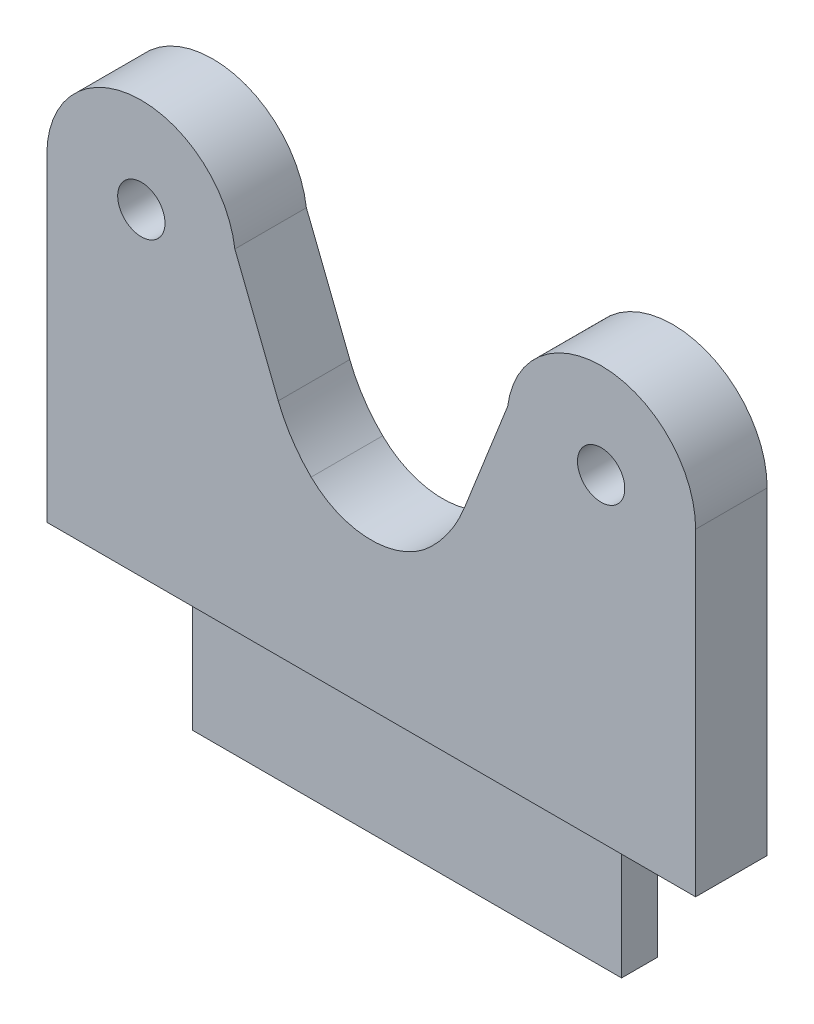
ISO-10303-21;
HEADER;
FILE_DESCRIPTION(('STEP AP214'),'2;1');
FILE_NAME('part.step','',(''),(''),'','','');
FILE_SCHEMA(('AUTOMOTIVE_DESIGN { 1 0 10303 214 1 1 1 1 }'));
ENDSEC;
DATA;
#1=APPLICATION_CONTEXT('core data for automotive mechanical design processes');
#2=APPLICATION_PROTOCOL_DEFINITION('international standard','automotive_design',2000,#1);
#3=PRODUCT_CONTEXT('',#1,'mechanical');
#4=PRODUCT('Part','Part','',(#3));
#5=PRODUCT_RELATED_PRODUCT_CATEGORY('part','',(#4));
#6=PRODUCT_DEFINITION_FORMATION('','',#4);
#7=PRODUCT_DEFINITION_CONTEXT('part definition',#1,'design');
#8=PRODUCT_DEFINITION('design','',#6,#7);
#9=PRODUCT_DEFINITION_SHAPE('','',#8);
#10=(LENGTH_UNIT() NAMED_UNIT(*) SI_UNIT(.MILLI.,.METRE.));
#11=(NAMED_UNIT(*) PLANE_ANGLE_UNIT() SI_UNIT($,.RADIAN.));
#12=(NAMED_UNIT(*) SI_UNIT($,.STERADIAN.) SOLID_ANGLE_UNIT());
#13=UNCERTAINTY_MEASURE_WITH_UNIT(LENGTH_MEASURE(1.E-05),#10,'distance_accuracy_value','');
#14=(GEOMETRIC_REPRESENTATION_CONTEXT(3) GLOBAL_UNCERTAINTY_ASSIGNED_CONTEXT((#13)) GLOBAL_UNIT_ASSIGNED_CONTEXT((#10,
#11,#12)) REPRESENTATION_CONTEXT('',''));
#15=CARTESIAN_POINT('',(0.,0.,0.));
#16=DIRECTION('',(0.,0.,1.));
#17=DIRECTION('',(1.,0.,0.));
#18=AXIS2_PLACEMENT_3D('',#15,#16,#17);
#19=CARTESIAN_POINT('',(0.,0.,0.));
#20=DIRECTION('',(0.,0.,1.));
#21=DIRECTION('',(1.,0.,0.));
#22=AXIS2_PLACEMENT_3D('',#19,#20,#21);
#23=PLANE('',#22);
#24=CARTESIAN_POINT('',(21.5908533619969,-2.54,0.));
#25=DIRECTION('',(0.,0.,1.));
#26=DIRECTION('',(1.,0.,0.));
#27=AXIS2_PLACEMENT_3D('',#24,#25,#26);
#28=CIRCLE('',#27,2.54);
#29=CARTESIAN_POINT('',(19.0510240343963,-2.5105553628006,0.));
#30=VERTEX_POINT('',#29);
#31=CARTESIAN_POINT('',(21.5908533619969,0.,0.));
#32=VERTEX_POINT('',#31);
#33=EDGE_CURVE('E48',#30,#32,#28,.F.);
#34=ORIENTED_EDGE('',*,*,#33,.T.);
#35=DIRECTION('',(-1.,0.,0.));
#36=VECTOR('',#35,1.);
#37=CARTESIAN_POINT('',(-19.05,0.,0.));
#38=LINE('',#37,#36);
#39=CARTESIAN_POINT('',(-21.5908533619969,0.,0.));
#40=VERTEX_POINT('',#39);
#41=EDGE_CURVE('E55',#32,#40,#38,.T.);
#42=ORIENTED_EDGE('',*,*,#41,.T.);
#43=CARTESIAN_POINT('',(-21.5908533619969,-2.54,0.));
#44=DIRECTION('',(0.,0.,1.));
#45=DIRECTION('',(1.,0.,0.));
#46=AXIS2_PLACEMENT_3D('',#43,#44,#45);
#47=CIRCLE('',#46,2.54);
#48=CARTESIAN_POINT('',(-19.0510240343963,-2.51055536280059,0.));
#49=VERTEX_POINT('',#48);
#50=EDGE_CURVE('E307',#40,#49,#47,.F.);
#51=ORIENTED_EDGE('',*,*,#50,.T.);
#52=CARTESIAN_POINT('',(-34.29,-2.68722318599705,0.));
#53=DIRECTION('',(0.,0.,1.));
#54=DIRECTION('',(1.,0.,0.));
#55=AXIS2_PLACEMENT_3D('',#52,#53,#54);
#56=CIRCLE('',#55,15.24);
#57=CARTESIAN_POINT('',(-19.05,-2.68722318599705,0.));
#58=VERTEX_POINT('',#57);
#59=EDGE_CURVE('E297',#49,#58,#56,.F.);
#60=ORIENTED_EDGE('',*,*,#59,.T.);
#61=DIRECTION('',(0.,-1.,0.));
#62=VECTOR('',#61,1.);
#63=CARTESIAN_POINT('',(-19.05,0.,0.));
#64=LINE('',#63,#62);
#65=CARTESIAN_POINT('',(-19.05,-12.7,0.));
#66=VERTEX_POINT('',#65);
#67=EDGE_CURVE('E174',#58,#66,#64,.T.);
#68=ORIENTED_EDGE('',*,*,#67,.T.);
#69=DIRECTION('',(1.,0.,0.));
#70=VECTOR('',#69,1.);
#71=CARTESIAN_POINT('',(-19.05,-12.7,0.));
#72=LINE('',#71,#70);
#73=CARTESIAN_POINT('',(19.05,-12.7,0.));
#74=VERTEX_POINT('',#73);
#75=EDGE_CURVE('E205',#66,#74,#72,.T.);
#76=ORIENTED_EDGE('',*,*,#75,.T.);
#77=DIRECTION('',(0.,1.,0.));
#78=VECTOR('',#77,1.);
#79=CARTESIAN_POINT('',(19.05,0.,0.));
#80=LINE('',#79,#78);
#81=CARTESIAN_POINT('',(19.05,-2.68722318599699,0.));
#82=VERTEX_POINT('',#81);
#83=EDGE_CURVE('E207',#74,#82,#80,.T.);
#84=ORIENTED_EDGE('',*,*,#83,.T.);
#85=CARTESIAN_POINT('',(34.29,-2.68722318599699,0.));
#86=DIRECTION('',(0.,0.,1.));
#87=DIRECTION('',(1.,0.,0.));
#88=AXIS2_PLACEMENT_3D('',#85,#86,#87);
#89=CIRCLE('',#88,15.24);
#90=EDGE_CURVE('E291',#82,#30,#89,.F.);
#91=ORIENTED_EDGE('',*,*,#90,.T.);
#92=EDGE_LOOP('',(#34,#42,#51,#60,#68,#76,#84,#91));
#93=FACE_BOUND('',#92,.T.);
#94=ADVANCED_FACE('F40',(#93),#23,.T.);
#95=CARTESIAN_POINT('',(-20.4183404029342,28.2668128413558,3.175));
#96=DIRECTION('',(0.,0.,-1.));
#97=DIRECTION('',(-1.,0.,0.));
#98=AXIS2_PLACEMENT_3D('',#95,#96,#97);
#99=CYLINDRICAL_SURFACE('',#98,8.382);
#100=DIRECTION('',(0.,0.,1.));
#101=VECTOR('',#100,1.);
#102=CARTESIAN_POINT('',(-28.800340402934,28.2668128413558,-32.9991912171343));
#103=LINE('',#102,#101);
#104=CARTESIAN_POINT('',(-28.800340402934,28.2668128413558,-3.175));
#105=VERTEX_POINT('',#104);
#106=CARTESIAN_POINT('',(-28.800340402934,28.2668128413558,3.175));
#107=VERTEX_POINT('',#106);
#108=EDGE_CURVE('E183',#105,#107,#103,.T.);
#109=ORIENTED_EDGE('',*,*,#108,.T.);
#110=CARTESIAN_POINT('',(-20.4183404029342,28.2668128413558,3.175));
#111=DIRECTION('',(0.,0.,1.));
#112=DIRECTION('',(-1.,0.,0.));
#113=AXIS2_PLACEMENT_3D('',#110,#111,#112);
#114=CIRCLE('',#113,8.382);
#115=CARTESIAN_POINT('',(-12.1074649834554,29.356433767138,3.175));
#116=VERTEX_POINT('',#115);
#117=EDGE_CURVE('E189',#116,#107,#114,.T.);
#118=ORIENTED_EDGE('',*,*,#117,.F.);
#119=DIRECTION('',(0.,0.,-1.));
#120=VECTOR('',#119,1.);
#121=CARTESIAN_POINT('',(-12.1074649834554,29.356433767138,3.175));
#122=LINE('',#121,#120);
#123=CARTESIAN_POINT('',(-12.1074649834554,29.356433767138,-3.175));
#124=VERTEX_POINT('',#123);
#125=EDGE_CURVE('E254',#116,#124,#122,.T.);
#126=ORIENTED_EDGE('',*,*,#125,.T.);
#127=CARTESIAN_POINT('',(-20.4183404029342,28.2668128413558,-3.175));
#128=DIRECTION('',(0.,0.,1.));
#129=DIRECTION('',(-1.,0.,0.));
#130=AXIS2_PLACEMENT_3D('',#127,#128,#129);
#131=CIRCLE('',#130,8.382);
#132=EDGE_CURVE('E243',#124,#105,#131,.T.);
#133=ORIENTED_EDGE('',*,*,#132,.T.);
#134=EDGE_LOOP('',(#109,#118,#126,#133));
#135=FACE_BOUND('',#134,.T.);
#136=ADVANCED_FACE('F349',(#135),#99,.T.);
#137=CARTESIAN_POINT('',(-34.29,-2.68722318599705,3.175));
#138=DIRECTION('',(0.,0.,1.));
#139=DIRECTION('',(1.,0.,0.));
#140=AXIS2_PLACEMENT_3D('',#137,#138,#139);
#141=CYLINDRICAL_SURFACE('',#140,15.24);
#142=ORIENTED_EDGE('',*,*,#59,.F.);
#143=DIRECTION('',(0.,0.,1.));
#144=VECTOR('',#143,1.);
#145=CARTESIAN_POINT('',(-19.0510240343963,-2.51055536280059,3.175));
#146=LINE('',#145,#144);
#147=CARTESIAN_POINT('',(-19.0510240343963,-2.51055536280059,-3.175));
#148=VERTEX_POINT('',#147);
#149=EDGE_CURVE('E301',#49,#148,#146,.F.);
#150=ORIENTED_EDGE('',*,*,#149,.T.);
#151=CARTESIAN_POINT('',(-34.29,-2.68722318599705,-3.175));
#152=DIRECTION('',(0.,0.,-1.));
#153=DIRECTION('',(-1.,0.,0.));
#154=AXIS2_PLACEMENT_3D('',#151,#152,#153);
#155=CIRCLE('',#154,15.24);
#156=CARTESIAN_POINT('',(-19.05,-2.68722318599705,-3.175));
#157=VERTEX_POINT('',#156);
#158=EDGE_CURVE('E294',#157,#148,#155,.F.);
#159=ORIENTED_EDGE('',*,*,#158,.F.);
#160=DIRECTION('',(0.,0.,-1.));
#161=VECTOR('',#160,1.);
#162=CARTESIAN_POINT('',(-19.05,-2.68722318599705,-3.175));
#163=LINE('',#162,#161);
#164=EDGE_CURVE('E286',#58,#157,#163,.T.);
#165=ORIENTED_EDGE('',*,*,#164,.F.);
#166=EDGE_LOOP('',(#142,#150,#159,#165));
#167=FACE_BOUND('',#166,.T.);
#168=ADVANCED_FACE('F392',(#167),#141,.F.);
#169=CARTESIAN_POINT('',(19.05,0.,3.175));
#170=DIRECTION('',(-1.,0.,0.));
#171=DIRECTION('',(0.,0.,1.));
#172=AXIS2_PLACEMENT_3D('',#169,#170,#171);
#173=PLANE('',#172);
#174=DIRECTION('',(0.,1.,0.));
#175=VECTOR('',#174,1.);
#176=CARTESIAN_POINT('',(19.05,0.,-3.175));
#177=LINE('',#176,#175);
#178=CARTESIAN_POINT('',(19.05,-12.7,-3.175));
#179=VERTEX_POINT('',#178);
#180=CARTESIAN_POINT('',(19.05,-2.68722318599699,-3.175));
#181=VERTEX_POINT('',#180);
#182=EDGE_CURVE('E221',#179,#181,#177,.T.);
#183=ORIENTED_EDGE('',*,*,#182,.T.);
#184=DIRECTION('',(0.,0.,-1.));
#185=VECTOR('',#184,1.);
#186=CARTESIAN_POINT('',(19.05,-2.68722318599699,0.));
#187=LINE('',#186,#185);
#188=EDGE_CURVE('E284',#181,#82,#187,.F.);
#189=ORIENTED_EDGE('',*,*,#188,.T.);
#190=ORIENTED_EDGE('',*,*,#83,.F.);
#191=DIRECTION('',(0.,0.,-1.));
#192=VECTOR('',#191,1.);
#193=CARTESIAN_POINT('',(19.05,-12.7,3.175));
#194=LINE('',#193,#192);
#195=EDGE_CURVE('E233',#74,#179,#194,.T.);
#196=ORIENTED_EDGE('',*,*,#195,.T.);
#197=EDGE_LOOP('',(#183,#189,#190,#196));
#198=FACE_BOUND('',#197,.T.);
#199=ADVANCED_FACE('F328',(#198),#173,.F.);
#200=CARTESIAN_POINT('',(-19.05,0.,3.175));
#201=DIRECTION('',(1.,0.,0.));
#202=DIRECTION('',(0.,0.,-1.));
#203=AXIS2_PLACEMENT_3D('',#200,#201,#202);
#204=PLANE('',#203);
#205=ORIENTED_EDGE('',*,*,#67,.F.);
#206=ORIENTED_EDGE('',*,*,#164,.T.);
#207=DIRECTION('',(0.,-1.,0.));
#208=VECTOR('',#207,1.);
#209=CARTESIAN_POINT('',(-19.05,0.,-3.175));
#210=LINE('',#209,#208);
#211=CARTESIAN_POINT('',(-19.05,-12.7,-3.175));
#212=VERTEX_POINT('',#211);
#213=EDGE_CURVE('E246',#157,#212,#210,.T.);
#214=ORIENTED_EDGE('',*,*,#213,.T.);
#215=DIRECTION('',(0.,0.,-1.));
#216=VECTOR('',#215,1.);
#217=CARTESIAN_POINT('',(-19.05,-12.7,3.175));
#218=LINE('',#217,#216);
#219=EDGE_CURVE('E251',#66,#212,#218,.T.);
#220=ORIENTED_EDGE('',*,*,#219,.F.);
#221=EDGE_LOOP('',(#205,#206,#214,#220));
#222=FACE_BOUND('',#221,.T.);
#223=ADVANCED_FACE('F337',(#222),#204,.F.);
#224=CARTESIAN_POINT('',(-19.05,-12.7,3.175));
#225=DIRECTION('',(0.,1.,0.));
#226=DIRECTION('',(0.,0.,1.));
#227=AXIS2_PLACEMENT_3D('',#224,#225,#226);
#228=PLANE('',#227);
#229=ORIENTED_EDGE('',*,*,#75,.F.);
#230=ORIENTED_EDGE('',*,*,#219,.T.);
#231=DIRECTION('',(1.,0.,0.));
#232=VECTOR('',#231,1.);
#233=CARTESIAN_POINT('',(-19.05,-12.7,-3.175));
#234=LINE('',#233,#232);
#235=EDGE_CURVE('E227',#212,#179,#234,.T.);
#236=ORIENTED_EDGE('',*,*,#235,.T.);
#237=ORIENTED_EDGE('',*,*,#195,.F.);
#238=EDGE_LOOP('',(#229,#230,#236,#237));
#239=FACE_BOUND('',#238,.T.);
#240=ADVANCED_FACE('F334',(#239),#228,.F.);
#241=CARTESIAN_POINT('',(20.418340402934,28.2668128413558,3.175));
#242=DIRECTION('',(0.,0.,-1.));
#243=DIRECTION('',(-1.,0.,0.));
#244=AXIS2_PLACEMENT_3D('',#241,#242,#243);
#245=CYLINDRICAL_SURFACE('',#244,8.382);
#246=CARTESIAN_POINT('',(20.418340402934,28.2668128413558,3.175));
#247=DIRECTION('',(0.,0.,1.));
#248=DIRECTION('',(1.,0.,0.));
#249=AXIS2_PLACEMENT_3D('',#246,#247,#248);
#250=CIRCLE('',#249,8.382);
#251=CARTESIAN_POINT('',(28.800340402934,28.2668128413558,3.175));
#252=VERTEX_POINT('',#251);
#253=CARTESIAN_POINT('',(12.1074649834551,29.3564337671381,3.175));
#254=VERTEX_POINT('',#253);
#255=EDGE_CURVE('E224',#252,#254,#250,.T.);
#256=ORIENTED_EDGE('',*,*,#255,.F.);
#257=DIRECTION('',(0.,0.,1.));
#258=VECTOR('',#257,1.);
#259=CARTESIAN_POINT('',(28.800340402934,28.2668128413558,-32.9991912171343));
#260=LINE('',#259,#258);
#261=CARTESIAN_POINT('',(28.800340402934,28.2668128413558,-3.175));
#262=VERTEX_POINT('',#261);
#263=EDGE_CURVE('E175',#262,#252,#260,.T.);
#264=ORIENTED_EDGE('',*,*,#263,.F.);
#265=CARTESIAN_POINT('',(20.418340402934,28.2668128413558,-3.175));
#266=DIRECTION('',(0.,0.,1.));
#267=DIRECTION('',(1.,0.,0.));
#268=AXIS2_PLACEMENT_3D('',#265,#266,#267);
#269=CIRCLE('',#268,8.382);
#270=CARTESIAN_POINT('',(12.1074649834551,29.3564337671381,-3.175));
#271=VERTEX_POINT('',#270);
#272=EDGE_CURVE('E236',#262,#271,#269,.T.);
#273=ORIENTED_EDGE('',*,*,#272,.T.);
#274=DIRECTION('',(0.,0.,-1.));
#275=VECTOR('',#274,1.);
#276=CARTESIAN_POINT('',(12.1074649834551,29.3564337671381,3.175));
#277=LINE('',#276,#275);
#278=EDGE_CURVE('E257',#254,#271,#277,.T.);
#279=ORIENTED_EDGE('',*,*,#278,.F.);
#280=EDGE_LOOP('',(#256,#264,#273,#279));
#281=FACE_BOUND('',#280,.T.);
#282=ADVANCED_FACE('F376',(#281),#245,.T.);
#283=CARTESIAN_POINT('',(5.08,11.576433767138,3.175));
#284=DIRECTION('',(0.929993574972529,-0.36757577519447,0.));
#285=DIRECTION('',(0.36757577519447,0.929993574972529,0.));
#286=AXIS2_PLACEMENT_3D('',#283,#284,#285);
#287=PLANE('',#286);
#288=DIRECTION('',(-0.36757577519447,-0.929993574972529,0.));
#289=VECTOR('',#288,1.);
#290=CARTESIAN_POINT('',(5.08,11.576433767138,-3.175));
#291=LINE('',#290,#289);
#292=CARTESIAN_POINT('',(8.25452792464972,19.6082214221682,-3.175));
#293=VERTEX_POINT('',#292);
#294=EDGE_CURVE('E238',#271,#293,#291,.T.);
#295=ORIENTED_EDGE('',*,*,#294,.T.);
#296=DIRECTION('',(0.,0.,-1.));
#297=VECTOR('',#296,1.);
#298=CARTESIAN_POINT('',(8.25452792464972,19.6082214221682,3.175));
#299=LINE('',#298,#297);
#300=CARTESIAN_POINT('',(8.25452792464972,19.6082214221682,3.175));
#301=VERTEX_POINT('',#300);
#302=EDGE_CURVE('E260',#293,#301,#299,.F.);
#303=ORIENTED_EDGE('',*,*,#302,.T.);
#304=DIRECTION('',(-0.36757577519447,-0.929993574972529,0.));
#305=VECTOR('',#304,1.);
#306=CARTESIAN_POINT('',(5.08,11.576433767138,3.175));
#307=LINE('',#306,#305);
#308=EDGE_CURVE('E226',#254,#301,#307,.T.);
#309=ORIENTED_EDGE('',*,*,#308,.F.);
#310=ORIENTED_EDGE('',*,*,#278,.T.);
#311=EDGE_LOOP('',(#295,#303,#309,#310));
#312=FACE_BOUND('',#311,.T.);
#313=ADVANCED_FACE('F371',(#312),#287,.F.);
#314=CARTESIAN_POINT('',(-5.08,11.576433767138,3.175));
#315=DIRECTION('',(-0.929993574972524,-0.367575775194481,0.));
#316=DIRECTION('',(0.367575775194481,-0.929993574972524,0.));
#317=AXIS2_PLACEMENT_3D('',#314,#315,#316);
#318=PLANE('',#317);
#319=DIRECTION('',(-0.367575775194481,0.929993574972524,0.));
#320=VECTOR('',#319,1.);
#321=CARTESIAN_POINT('',(-5.08,11.576433767138,3.175));
#322=LINE('',#321,#320);
#323=CARTESIAN_POINT('',(-8.25452792464977,19.6082214221681,3.175));
#324=VERTEX_POINT('',#323);
#325=EDGE_CURVE('E230',#324,#116,#322,.T.);
#326=ORIENTED_EDGE('',*,*,#325,.F.);
#327=DIRECTION('',(0.,0.,-1.));
#328=VECTOR('',#327,1.);
#329=CARTESIAN_POINT('',(-8.25452792464977,19.6082214221681,-3.175));
#330=LINE('',#329,#328);
#331=CARTESIAN_POINT('',(-8.25452792464977,19.6082214221681,-3.175));
#332=VERTEX_POINT('',#331);
#333=EDGE_CURVE('E263',#324,#332,#330,.T.);
#334=ORIENTED_EDGE('',*,*,#333,.T.);
#335=DIRECTION('',(-0.367575775194481,0.929993574972524,0.));
#336=VECTOR('',#335,1.);
#337=CARTESIAN_POINT('',(-5.08,11.576433767138,-3.175));
#338=LINE('',#337,#336);
#339=EDGE_CURVE('E241',#332,#124,#338,.T.);
#340=ORIENTED_EDGE('',*,*,#339,.T.);
#341=ORIENTED_EDGE('',*,*,#125,.F.);
#342=EDGE_LOOP('',(#326,#334,#340,#341));
#343=FACE_BOUND('',#342,.T.);
#344=ADVANCED_FACE('F353',(#343),#318,.F.);
#345=CARTESIAN_POINT('',(-20.4183404029342,28.2668128413558,3.175));
#346=DIRECTION('',(0.,0.,-1.));
#347=DIRECTION('',(-1.,0.,0.));
#348=AXIS2_PLACEMENT_3D('',#345,#346,#347);
#349=PLANE('',#348);
#350=DIRECTION('',(0.,-1.,0.));
#351=VECTOR('',#350,1.);
#352=CARTESIAN_POINT('',(-28.800340402934,28.2668128413558,3.175));
#353=LINE('',#352,#351);
#354=CARTESIAN_POINT('',(-28.800340402934,0.,3.175));
#355=VERTEX_POINT('',#354);
#356=EDGE_CURVE('E179',#107,#355,#353,.T.);
#357=ORIENTED_EDGE('',*,*,#356,.T.);
#358=DIRECTION('',(-1.,0.,0.));
#359=VECTOR('',#358,1.);
#360=CARTESIAN_POINT('',(-19.05,0.,3.175));
#361=LINE('',#360,#359);
#362=CARTESIAN_POINT('',(28.800340402934,0.,3.175));
#363=VERTEX_POINT('',#362);
#364=EDGE_CURVE('E162',#363,#355,#361,.T.);
#365=ORIENTED_EDGE('',*,*,#364,.F.);
#366=DIRECTION('',(0.,-1.,0.));
#367=VECTOR('',#366,1.);
#368=CARTESIAN_POINT('',(28.800340402934,28.2668128413558,3.175));
#369=LINE('',#368,#367);
#370=EDGE_CURVE('E195',#252,#363,#369,.T.);
#371=ORIENTED_EDGE('',*,*,#370,.F.);
#372=ORIENTED_EDGE('',*,*,#255,.T.);
#373=ORIENTED_EDGE('',*,*,#308,.T.);
#374=CARTESIAN_POINT('',(-3.55639047750139,24.276433767138,3.175));
#375=DIRECTION('',(0.,0.,-1.));
#376=DIRECTION('',(-1.,0.,0.));
#377=AXIS2_PLACEMENT_3D('',#374,#375,#376);
#378=CIRCLE('',#377,12.7);
#379=CARTESIAN_POINT('',(5.33458571625195,15.20777662718,3.175));
#380=VERTEX_POINT('',#379);
#381=EDGE_CURVE('E267',#301,#380,#378,.T.);
#382=ORIENTED_EDGE('',*,*,#381,.T.);
#383=CARTESIAN_POINT('',(0.,20.6489709111548,3.175));
#384=DIRECTION('',(0.,0.,-1.));
#385=DIRECTION('',(-1.,0.,0.));
#386=AXIS2_PLACEMENT_3D('',#383,#384,#385);
#387=CIRCLE('',#386,7.62);
#388=CARTESIAN_POINT('',(-5.33458571625206,15.20777662718,3.175));
#389=VERTEX_POINT('',#388);
#390=EDGE_CURVE('E280',#380,#389,#387,.T.);
#391=ORIENTED_EDGE('',*,*,#390,.T.);
#392=CARTESIAN_POINT('',(3.55639047750129,24.276433767138,3.175));
#393=DIRECTION('',(0.,0.,-1.));
#394=DIRECTION('',(-1.,0.,0.));
#395=AXIS2_PLACEMENT_3D('',#392,#393,#394);
#396=CIRCLE('',#395,12.7);
#397=EDGE_CURVE('E273',#389,#324,#396,.T.);
#398=ORIENTED_EDGE('',*,*,#397,.T.);
#399=ORIENTED_EDGE('',*,*,#325,.T.);
#400=ORIENTED_EDGE('',*,*,#117,.T.);
#401=EDGE_LOOP('',(#357,#365,#371,#372,#373,#382,#391,#398,#399,#400));
#402=FACE_BOUND('',#401,.T.);
#403=CARTESIAN_POINT('',(20.4102162038277,28.2444917877597,3.175));
#404=DIRECTION('',(0.,0.,-1.));
#405=DIRECTION('',(-1.,0.,0.));
#406=AXIS2_PLACEMENT_3D('',#403,#404,#405);
#407=CIRCLE('',#406,2.1);
#408=CARTESIAN_POINT('',(18.3102162038277,28.2444917877597,3.175));
#409=VERTEX_POINT('',#408);
#410=EDGE_CURVE('E210',#409,#409,#407,.T.);
#411=ORIENTED_EDGE('',*,*,#410,.T.);
#412=EDGE_LOOP('',(#411));
#413=FACE_BOUND('',#412,.T.);
#414=CARTESIAN_POINT('',(-20.4102162038277,28.2444917877597,3.175));
#415=DIRECTION('',(0.,0.,1.));
#416=DIRECTION('',(1.,0.,0.));
#417=AXIS2_PLACEMENT_3D('',#414,#415,#416);
#418=CIRCLE('',#417,2.1);
#419=CARTESIAN_POINT('',(-18.3102162038277,28.2444917877597,3.175));
#420=VERTEX_POINT('',#419);
#421=EDGE_CURVE('E215',#420,#420,#418,.T.);
#422=ORIENTED_EDGE('',*,*,#421,.F.);
#423=EDGE_LOOP('',(#422));
#424=FACE_BOUND('',#423,.T.);
#425=ADVANCED_FACE('F186',(#402,#413,#424),#349,.F.);
#426=CARTESIAN_POINT('',(-20.4183404029342,28.2668128413558,-3.175));
#427=DIRECTION('',(0.,0.,-1.));
#428=DIRECTION('',(-1.,0.,0.));
#429=AXIS2_PLACEMENT_3D('',#426,#427,#428);
#430=PLANE('',#429);
#431=ORIENTED_EDGE('',*,*,#272,.F.);
#432=DIRECTION('',(0.,1.,0.));
#433=VECTOR('',#432,1.);
#434=CARTESIAN_POINT('',(28.800340402934,28.2668128413558,-3.175));
#435=LINE('',#434,#433);
#436=CARTESIAN_POINT('',(28.800340402934,0.,-3.175));
#437=VERTEX_POINT('',#436);
#438=EDGE_CURVE('E199',#437,#262,#435,.T.);
#439=ORIENTED_EDGE('',*,*,#438,.F.);
#440=DIRECTION('',(1.,0.,0.));
#441=VECTOR('',#440,1.);
#442=CARTESIAN_POINT('',(28.800340402934,0.,-3.175));
#443=LINE('',#442,#441);
#444=CARTESIAN_POINT('',(21.5908533619969,0.,-3.175));
#445=VERTEX_POINT('',#444);
#446=EDGE_CURVE('E198',#445,#437,#443,.T.);
#447=ORIENTED_EDGE('',*,*,#446,.F.);
#448=CARTESIAN_POINT('',(21.5908533619969,-2.54,-3.175));
#449=DIRECTION('',(0.,0.,-1.));
#450=DIRECTION('',(-1.,0.,0.));
#451=AXIS2_PLACEMENT_3D('',#448,#449,#450);
#452=CIRCLE('',#451,2.54);
#453=CARTESIAN_POINT('',(19.0510240343963,-2.5105553628006,-3.175));
#454=VERTEX_POINT('',#453);
#455=EDGE_CURVE('E11',#445,#454,#452,.F.);
#456=ORIENTED_EDGE('',*,*,#455,.T.);
#457=CARTESIAN_POINT('',(34.29,-2.68722318599699,-3.175));
#458=DIRECTION('',(0.,0.,-1.));
#459=DIRECTION('',(-1.,0.,0.));
#460=AXIS2_PLACEMENT_3D('',#457,#458,#459);
#461=CIRCLE('',#460,15.24);
#462=EDGE_CURVE('E289',#454,#181,#461,.F.);
#463=ORIENTED_EDGE('',*,*,#462,.T.);
#464=ORIENTED_EDGE('',*,*,#182,.F.);
#465=ORIENTED_EDGE('',*,*,#235,.F.);
#466=ORIENTED_EDGE('',*,*,#213,.F.);
#467=ORIENTED_EDGE('',*,*,#158,.T.);
#468=CARTESIAN_POINT('',(-21.5908533619969,-2.54,-3.175));
#469=DIRECTION('',(0.,0.,-1.));
#470=DIRECTION('',(-1.,0.,0.));
#471=AXIS2_PLACEMENT_3D('',#468,#469,#470);
#472=CIRCLE('',#471,2.54);
#473=CARTESIAN_POINT('',(-21.5908533619969,0.,-3.175));
#474=VERTEX_POINT('',#473);
#475=EDGE_CURVE('E309',#148,#474,#472,.F.);
#476=ORIENTED_EDGE('',*,*,#475,.T.);
#477=DIRECTION('',(-1.,0.,0.));
#478=VECTOR('',#477,1.);
#479=CARTESIAN_POINT('',(-28.800340402934,0.,-3.175));
#480=LINE('',#479,#478);
#481=CARTESIAN_POINT('',(-28.800340402934,0.,-3.175));
#482=VERTEX_POINT('',#481);
#483=EDGE_CURVE('E193',#474,#482,#480,.T.);
#484=ORIENTED_EDGE('',*,*,#483,.T.);
#485=DIRECTION('',(0.,1.,0.));
#486=VECTOR('',#485,1.);
#487=CARTESIAN_POINT('',(-28.800340402934,28.2668128413558,-3.175));
#488=LINE('',#487,#486);
#489=EDGE_CURVE('E182',#482,#105,#488,.T.);
#490=ORIENTED_EDGE('',*,*,#489,.T.);
#491=ORIENTED_EDGE('',*,*,#132,.F.);
#492=ORIENTED_EDGE('',*,*,#339,.F.);
#493=CARTESIAN_POINT('',(3.55639047750129,24.276433767138,-3.175));
#494=DIRECTION('',(0.,0.,-1.));
#495=DIRECTION('',(-1.,0.,0.));
#496=AXIS2_PLACEMENT_3D('',#493,#494,#495);
#497=CIRCLE('',#496,12.7);
#498=CARTESIAN_POINT('',(-5.33458571625206,15.20777662718,-3.175));
#499=VERTEX_POINT('',#498);
#500=EDGE_CURVE('E270',#332,#499,#497,.F.);
#501=ORIENTED_EDGE('',*,*,#500,.T.);
#502=CARTESIAN_POINT('',(0.,20.6489709111548,-3.175));
#503=DIRECTION('',(0.,0.,-1.));
#504=DIRECTION('',(-1.,0.,0.));
#505=AXIS2_PLACEMENT_3D('',#502,#503,#504);
#506=CIRCLE('',#505,7.62);
#507=CARTESIAN_POINT('',(5.33458571625195,15.20777662718,-3.175));
#508=VERTEX_POINT('',#507);
#509=EDGE_CURVE('E282',#499,#508,#506,.F.);
#510=ORIENTED_EDGE('',*,*,#509,.T.);
#511=CARTESIAN_POINT('',(-3.55639047750139,24.276433767138,-3.175));
#512=DIRECTION('',(0.,0.,-1.));
#513=DIRECTION('',(-1.,0.,0.));
#514=AXIS2_PLACEMENT_3D('',#511,#512,#513);
#515=CIRCLE('',#514,12.7);
#516=EDGE_CURVE('E265',#508,#293,#515,.F.);
#517=ORIENTED_EDGE('',*,*,#516,.T.);
#518=ORIENTED_EDGE('',*,*,#294,.F.);
#519=EDGE_LOOP('',(#431,#439,#447,#456,#463,#464,#465,#466,#467,#476,#484,#490,#491,#492,#501,
#510,#517,#518));
#520=FACE_BOUND('',#519,.T.);
#521=CARTESIAN_POINT('',(20.4102162038277,28.2444917877597,-3.175));
#522=DIRECTION('',(0.,0.,-1.));
#523=DIRECTION('',(-1.,0.,0.));
#524=AXIS2_PLACEMENT_3D('',#521,#522,#523);
#525=CIRCLE('',#524,2.1);
#526=CARTESIAN_POINT('',(18.3102162038277,28.2444917877597,-3.175));
#527=VERTEX_POINT('',#526);
#528=EDGE_CURVE('E212',#527,#527,#525,.T.);
#529=ORIENTED_EDGE('',*,*,#528,.F.);
#530=EDGE_LOOP('',(#529));
#531=FACE_BOUND('',#530,.T.);
#532=CARTESIAN_POINT('',(-20.4102162038277,28.2444917877597,-3.175));
#533=DIRECTION('',(0.,0.,1.));
#534=DIRECTION('',(1.,0.,0.));
#535=AXIS2_PLACEMENT_3D('',#532,#533,#534);
#536=CIRCLE('',#535,2.1);
#537=CARTESIAN_POINT('',(-18.3102162038277,28.2444917877597,-3.175));
#538=VERTEX_POINT('',#537);
#539=EDGE_CURVE('E218',#538,#538,#536,.T.);
#540=ORIENTED_EDGE('',*,*,#539,.T.);
#541=EDGE_LOOP('',(#540));
#542=FACE_BOUND('',#541,.T.);
#543=ADVANCED_FACE('F319',(#520,#531,#542),#430,.T.);
#544=CARTESIAN_POINT('',(-20.4102162038277,28.2444917877597,-3.175));
#545=DIRECTION('',(0.,0.,1.));
#546=DIRECTION('',(1.,0.,0.));
#547=AXIS2_PLACEMENT_3D('',#544,#545,#546);
#548=CYLINDRICAL_SURFACE('',#547,2.1);
#549=ORIENTED_EDGE('',*,*,#539,.F.);
#550=EDGE_LOOP('',(#549));
#551=FACE_BOUND('',#550,.T.);
#552=ORIENTED_EDGE('',*,*,#421,.T.);
#553=EDGE_LOOP('',(#552));
#554=FACE_BOUND('',#553,.T.);
#555=ADVANCED_FACE('F400',(#551,#554),#548,.F.);
#556=CARTESIAN_POINT('',(20.4102162038277,28.2444917877597,-3.175));
#557=DIRECTION('',(0.,0.,1.));
#558=DIRECTION('',(1.,0.,0.));
#559=AXIS2_PLACEMENT_3D('',#556,#557,#558);
#560=CYLINDRICAL_SURFACE('',#559,2.1);
#561=ORIENTED_EDGE('',*,*,#528,.T.);
#562=EDGE_LOOP('',(#561));
#563=FACE_BOUND('',#562,.T.);
#564=ORIENTED_EDGE('',*,*,#410,.F.);
#565=EDGE_LOOP('',(#564));
#566=FACE_BOUND('',#565,.T.);
#567=ADVANCED_FACE('F397',(#563,#566),#560,.F.);
#568=CARTESIAN_POINT('',(-19.05,0.,0.));
#569=DIRECTION('',(0.,1.,0.));
#570=DIRECTION('',(0.,0.,1.));
#571=AXIS2_PLACEMENT_3D('',#568,#569,#570);
#572=PLANE('',#571);
#573=ORIENTED_EDGE('',*,*,#364,.T.);
#574=DIRECTION('',(0.,0.,1.));
#575=VECTOR('',#574,1.);
#576=CARTESIAN_POINT('',(-28.800340402934,0.,-32.9991912171343));
#577=LINE('',#576,#575);
#578=EDGE_CURVE('E166',#482,#355,#577,.T.);
#579=ORIENTED_EDGE('',*,*,#578,.F.);
#580=ORIENTED_EDGE('',*,*,#483,.F.);
#581=DIRECTION('',(0.,0.,-1.));
#582=VECTOR('',#581,1.);
#583=CARTESIAN_POINT('',(-21.5908533619969,0.,0.));
#584=LINE('',#583,#582);
#585=EDGE_CURVE('E299',#474,#40,#584,.F.);
#586=ORIENTED_EDGE('',*,*,#585,.T.);
#587=ORIENTED_EDGE('',*,*,#41,.F.);
#588=DIRECTION('',(0.,0.,1.));
#589=VECTOR('',#588,1.);
#590=CARTESIAN_POINT('',(21.5908533619969,0.,-32.9991912171343));
#591=LINE('',#590,#589);
#592=EDGE_CURVE('E60',#32,#445,#591,.F.);
#593=ORIENTED_EDGE('',*,*,#592,.T.);
#594=ORIENTED_EDGE('',*,*,#446,.T.);
#595=DIRECTION('',(0.,0.,1.));
#596=VECTOR('',#595,1.);
#597=CARTESIAN_POINT('',(28.800340402934,0.,-32.9991912171343));
#598=LINE('',#597,#596);
#599=EDGE_CURVE('E169',#437,#363,#598,.T.);
#600=ORIENTED_EDGE('',*,*,#599,.T.);
#601=EDGE_LOOP('',(#573,#579,#580,#586,#587,#593,#594,#600));
#602=FACE_BOUND('',#601,.T.);
#603=ADVANCED_FACE('F164',(#602),#572,.F.);
#604=CARTESIAN_POINT('',(3.55639047750129,24.276433767138,3.175));
#605=DIRECTION('',(0.,0.,1.));
#606=DIRECTION('',(1.,0.,0.));
#607=AXIS2_PLACEMENT_3D('',#604,#605,#606);
#608=CYLINDRICAL_SURFACE('',#607,12.7);
#609=ORIENTED_EDGE('',*,*,#397,.F.);
#610=DIRECTION('',(0.,0.,1.));
#611=VECTOR('',#610,1.);
#612=CARTESIAN_POINT('',(-5.33458571625206,15.20777662718,3.175));
#613=LINE('',#612,#611);
#614=EDGE_CURVE('E278',#389,#499,#613,.F.);
#615=ORIENTED_EDGE('',*,*,#614,.T.);
#616=ORIENTED_EDGE('',*,*,#500,.F.);
#617=ORIENTED_EDGE('',*,*,#333,.F.);
#618=EDGE_LOOP('',(#609,#615,#616,#617));
#619=FACE_BOUND('',#618,.T.);
#620=ADVANCED_FACE('F359',(#619),#608,.F.);
#621=CARTESIAN_POINT('',(-3.55639047750139,24.276433767138,3.175));
#622=DIRECTION('',(0.,0.,1.));
#623=DIRECTION('',(1.,0.,0.));
#624=AXIS2_PLACEMENT_3D('',#621,#622,#623);
#625=CYLINDRICAL_SURFACE('',#624,12.7);
#626=ORIENTED_EDGE('',*,*,#516,.F.);
#627=DIRECTION('',(0.,0.,1.));
#628=VECTOR('',#627,1.);
#629=CARTESIAN_POINT('',(5.33458571625195,15.20777662718,3.175));
#630=LINE('',#629,#628);
#631=EDGE_CURVE('E275',#508,#380,#630,.T.);
#632=ORIENTED_EDGE('',*,*,#631,.T.);
#633=ORIENTED_EDGE('',*,*,#381,.F.);
#634=ORIENTED_EDGE('',*,*,#302,.F.);
#635=EDGE_LOOP('',(#626,#632,#633,#634));
#636=FACE_BOUND('',#635,.T.);
#637=ADVANCED_FACE('F368',(#636),#625,.F.);
#638=CARTESIAN_POINT('',(0.,20.6489709111548,3.175));
#639=DIRECTION('',(0.,0.,-1.));
#640=DIRECTION('',(-1.,0.,0.));
#641=AXIS2_PLACEMENT_3D('',#638,#639,#640);
#642=CYLINDRICAL_SURFACE('',#641,7.62);
#643=ORIENTED_EDGE('',*,*,#509,.F.);
#644=ORIENTED_EDGE('',*,*,#614,.F.);
#645=ORIENTED_EDGE('',*,*,#390,.F.);
#646=ORIENTED_EDGE('',*,*,#631,.F.);
#647=EDGE_LOOP('',(#643,#644,#645,#646));
#648=FACE_BOUND('',#647,.T.);
#649=ADVANCED_FACE('F362',(#648),#642,.F.);
#650=CARTESIAN_POINT('',(34.29,-2.68722318599699,3.175));
#651=DIRECTION('',(0.,0.,1.));
#652=DIRECTION('',(1.,0.,0.));
#653=AXIS2_PLACEMENT_3D('',#650,#651,#652);
#654=CYLINDRICAL_SURFACE('',#653,15.24);
#655=ORIENTED_EDGE('',*,*,#462,.F.);
#656=DIRECTION('',(0.,0.,1.));
#657=VECTOR('',#656,1.);
#658=CARTESIAN_POINT('',(19.0510240343963,-2.5105553628006,3.175));
#659=LINE('',#658,#657);
#660=EDGE_CURVE('E303',#454,#30,#659,.T.);
#661=ORIENTED_EDGE('',*,*,#660,.T.);
#662=ORIENTED_EDGE('',*,*,#90,.F.);
#663=ORIENTED_EDGE('',*,*,#188,.F.);
#664=EDGE_LOOP('',(#655,#661,#662,#663));
#665=FACE_BOUND('',#664,.T.);
#666=ADVANCED_FACE('F325',(#665),#654,.F.);
#667=CARTESIAN_POINT('',(28.800340402934,28.2668128413558,-32.9991912171343));
#668=DIRECTION('',(1.,0.,0.));
#669=DIRECTION('',(0.,0.,-1.));
#670=AXIS2_PLACEMENT_3D('',#667,#668,#669);
#671=PLANE('',#670);
#672=ORIENTED_EDGE('',*,*,#599,.F.);
#673=ORIENTED_EDGE('',*,*,#438,.T.);
#674=ORIENTED_EDGE('',*,*,#263,.T.);
#675=ORIENTED_EDGE('',*,*,#370,.T.);
#676=EDGE_LOOP('',(#672,#673,#674,#675));
#677=FACE_BOUND('',#676,.T.);
#678=ADVANCED_FACE('F378',(#677),#671,.T.);
#679=CARTESIAN_POINT('',(-28.800340402934,28.2668128413558,-32.9991912171343));
#680=DIRECTION('',(1.,0.,0.));
#681=DIRECTION('',(0.,0.,-1.));
#682=AXIS2_PLACEMENT_3D('',#679,#680,#681);
#683=PLANE('',#682);
#684=ORIENTED_EDGE('',*,*,#489,.F.);
#685=ORIENTED_EDGE('',*,*,#578,.T.);
#686=ORIENTED_EDGE('',*,*,#356,.F.);
#687=ORIENTED_EDGE('',*,*,#108,.F.);
#688=EDGE_LOOP('',(#684,#685,#686,#687));
#689=FACE_BOUND('',#688,.T.);
#690=ADVANCED_FACE('F178',(#689),#683,.F.);
#691=CARTESIAN_POINT('',(-21.5908533619969,-2.54,3.175));
#692=DIRECTION('',(0.,0.,1.));
#693=DIRECTION('',(1.,0.,0.));
#694=AXIS2_PLACEMENT_3D('',#691,#692,#693);
#695=CYLINDRICAL_SURFACE('',#694,2.54);
#696=ORIENTED_EDGE('',*,*,#475,.F.);
#697=ORIENTED_EDGE('',*,*,#149,.F.);
#698=ORIENTED_EDGE('',*,*,#50,.F.);
#699=ORIENTED_EDGE('',*,*,#585,.F.);
#700=EDGE_LOOP('',(#696,#697,#698,#699));
#701=FACE_BOUND('',#700,.T.);
#702=ADVANCED_FACE('F345',(#701),#695,.F.);
#703=CARTESIAN_POINT('',(21.5908533619969,-2.54,3.175));
#704=DIRECTION('',(0.,0.,1.));
#705=DIRECTION('',(1.,0.,0.));
#706=AXIS2_PLACEMENT_3D('',#703,#704,#705);
#707=CYLINDRICAL_SURFACE('',#706,2.54);
#708=ORIENTED_EDGE('',*,*,#455,.F.);
#709=ORIENTED_EDGE('',*,*,#592,.F.);
#710=ORIENTED_EDGE('',*,*,#33,.F.);
#711=ORIENTED_EDGE('',*,*,#660,.F.);
#712=EDGE_LOOP('',(#708,#709,#710,#711));
#713=FACE_BOUND('',#712,.T.);
#714=ADVANCED_FACE('F42',(#713),#707,.F.);
#715=CLOSED_SHELL('',(#94,#136,#168,#199,#223,#240,#282,#313,#344,#425,#543,#555,#567,#603,#620,
#637,#649,#666,#678,#690,#702,#714));
#716=MANIFOLD_SOLID_BREP('B2',#715);
#717=ADVANCED_BREP_SHAPE_REPRESENTATION('',(#18,#716),#14);
#718=SHAPE_DEFINITION_REPRESENTATION(#9,#717);
ENDSEC;
END-ISO-10303-21;
